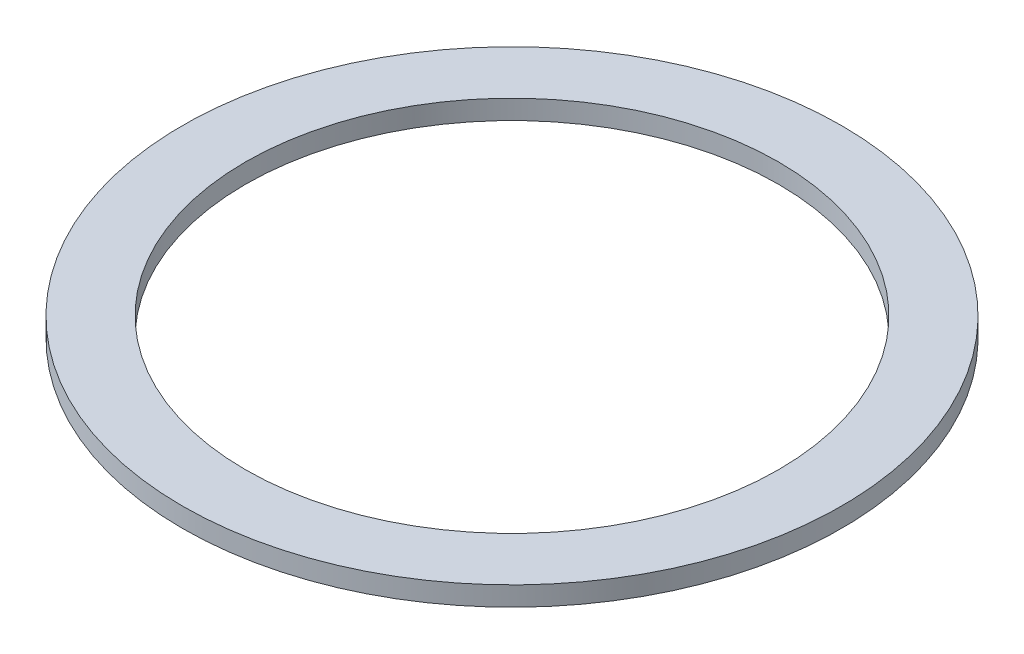
ISO-10303-21;
HEADER;
FILE_DESCRIPTION(('STEP AP214'),'2;1');
FILE_NAME('part.step','',(''),(''),'','','');
FILE_SCHEMA(('AUTOMOTIVE_DESIGN { 1 0 10303 214 1 1 1 1 }'));
ENDSEC;
DATA;
#1=APPLICATION_CONTEXT('core data for automotive mechanical design processes');
#2=APPLICATION_PROTOCOL_DEFINITION('international standard','automotive_design',2000,#1);
#3=PRODUCT_CONTEXT('',#1,'mechanical');
#4=PRODUCT('Part','Part','',(#3));
#5=PRODUCT_RELATED_PRODUCT_CATEGORY('part','',(#4));
#6=PRODUCT_DEFINITION_FORMATION('','',#4);
#7=PRODUCT_DEFINITION_CONTEXT('part definition',#1,'design');
#8=PRODUCT_DEFINITION('design','',#6,#7);
#9=PRODUCT_DEFINITION_SHAPE('','',#8);
#10=(LENGTH_UNIT() NAMED_UNIT(*) SI_UNIT(.MILLI.,.METRE.));
#11=(NAMED_UNIT(*) PLANE_ANGLE_UNIT() SI_UNIT($,.RADIAN.));
#12=(NAMED_UNIT(*) SI_UNIT($,.STERADIAN.) SOLID_ANGLE_UNIT());
#13=UNCERTAINTY_MEASURE_WITH_UNIT(LENGTH_MEASURE(1.E-05),#10,'distance_accuracy_value','');
#14=(GEOMETRIC_REPRESENTATION_CONTEXT(3) GLOBAL_UNCERTAINTY_ASSIGNED_CONTEXT((#13)) GLOBAL_UNIT_ASSIGNED_CONTEXT((#10,
#11,#12)) REPRESENTATION_CONTEXT('',''));
#15=CARTESIAN_POINT('',(0.,0.,0.));
#16=DIRECTION('',(0.,0.,1.));
#17=DIRECTION('',(1.,0.,0.));
#18=AXIS2_PLACEMENT_3D('',#15,#16,#17);
#19=CARTESIAN_POINT('',(0.,-1.,0.));
#20=DIRECTION('',(0.,1.,0.));
#21=DIRECTION('',(0.,0.,1.));
#22=AXIS2_PLACEMENT_3D('',#19,#20,#21);
#23=CYLINDRICAL_SURFACE('',#22,34.);
#24=CARTESIAN_POINT('',(0.,-1.,0.));
#25=DIRECTION('',(0.,1.,0.));
#26=DIRECTION('',(0.,0.,1.));
#27=AXIS2_PLACEMENT_3D('',#24,#25,#26);
#28=CIRCLE('',#27,34.);
#29=CARTESIAN_POINT('',(0.,-1.,34.));
#30=VERTEX_POINT('',#29);
#31=EDGE_CURVE('E10',#30,#30,#28,.T.);
#32=ORIENTED_EDGE('',*,*,#31,.T.);
#33=EDGE_LOOP('',(#32));
#34=FACE_BOUND('',#33,.T.);
#35=CARTESIAN_POINT('',(0.,0.999999999999998,0.));
#36=DIRECTION('',(0.,1.,0.));
#37=DIRECTION('',(0.,0.,1.));
#38=AXIS2_PLACEMENT_3D('',#35,#36,#37);
#39=CIRCLE('',#38,34.);
#40=CARTESIAN_POINT('',(0.,0.999999999999998,34.));
#41=VERTEX_POINT('',#40);
#42=EDGE_CURVE('E49',#41,#41,#39,.T.);
#43=ORIENTED_EDGE('',*,*,#42,.F.);
#44=EDGE_LOOP('',(#43));
#45=FACE_BOUND('',#44,.T.);
#46=ADVANCED_FACE('F39',(#34,#45),#23,.T.);
#47=CARTESIAN_POINT('',(0.,-1.,0.));
#48=DIRECTION('',(0.,1.,0.));
#49=DIRECTION('',(0.,0.,1.));
#50=AXIS2_PLACEMENT_3D('',#47,#48,#49);
#51=PLANE('',#50);
#52=CARTESIAN_POINT('',(0.,-1.,0.));
#53=DIRECTION('',(0.,1.,0.));
#54=DIRECTION('',(0.,0.,1.));
#55=AXIS2_PLACEMENT_3D('',#52,#53,#54);
#56=CIRCLE('',#55,27.5);
#57=CARTESIAN_POINT('',(0.,-1.,27.5));
#58=VERTEX_POINT('',#57);
#59=EDGE_CURVE('E45',#58,#58,#56,.T.);
#60=ORIENTED_EDGE('',*,*,#59,.T.);
#61=EDGE_LOOP('',(#60));
#62=FACE_BOUND('',#61,.T.);
#63=ORIENTED_EDGE('',*,*,#31,.F.);
#64=EDGE_LOOP('',(#63));
#65=FACE_BOUND('',#64,.T.);
#66=ADVANCED_FACE('F68',(#62,#65),#51,.F.);
#67=CARTESIAN_POINT('',(0.,-1.,0.));
#68=DIRECTION('',(0.,1.,0.));
#69=DIRECTION('',(0.,0.,1.));
#70=AXIS2_PLACEMENT_3D('',#67,#68,#69);
#71=CYLINDRICAL_SURFACE('',#70,27.5);
#72=ORIENTED_EDGE('',*,*,#59,.F.);
#73=EDGE_LOOP('',(#72));
#74=FACE_BOUND('',#73,.T.);
#75=CARTESIAN_POINT('',(0.,0.999999999999998,0.));
#76=DIRECTION('',(0.,1.,0.));
#77=DIRECTION('',(0.,0.,1.));
#78=AXIS2_PLACEMENT_3D('',#75,#76,#77);
#79=CIRCLE('',#78,27.5);
#80=CARTESIAN_POINT('',(0.,0.999999999999998,27.5));
#81=VERTEX_POINT('',#80);
#82=EDGE_CURVE('E53',#81,#81,#79,.T.);
#83=ORIENTED_EDGE('',*,*,#82,.T.);
#84=EDGE_LOOP('',(#83));
#85=FACE_BOUND('',#84,.T.);
#86=ADVANCED_FACE('F59',(#74,#85),#71,.F.);
#87=CARTESIAN_POINT('',(0.,0.999999999999998,0.));
#88=DIRECTION('',(0.,1.,0.));
#89=DIRECTION('',(0.,0.,1.));
#90=AXIS2_PLACEMENT_3D('',#87,#88,#89);
#91=PLANE('',#90);
#92=ORIENTED_EDGE('',*,*,#42,.T.);
#93=EDGE_LOOP('',(#92));
#94=FACE_BOUND('',#93,.T.);
#95=ORIENTED_EDGE('',*,*,#82,.F.);
#96=EDGE_LOOP('',(#95));
#97=FACE_BOUND('',#96,.T.);
#98=ADVANCED_FACE('F61',(#94,#97),#91,.T.);
#99=CLOSED_SHELL('',(#46,#66,#86,#98));
#100=MANIFOLD_SOLID_BREP('B2',#99);
#101=ADVANCED_BREP_SHAPE_REPRESENTATION('',(#18,#100),#14);
#102=SHAPE_DEFINITION_REPRESENTATION(#9,#101);
ENDSEC;
END-ISO-10303-21;
